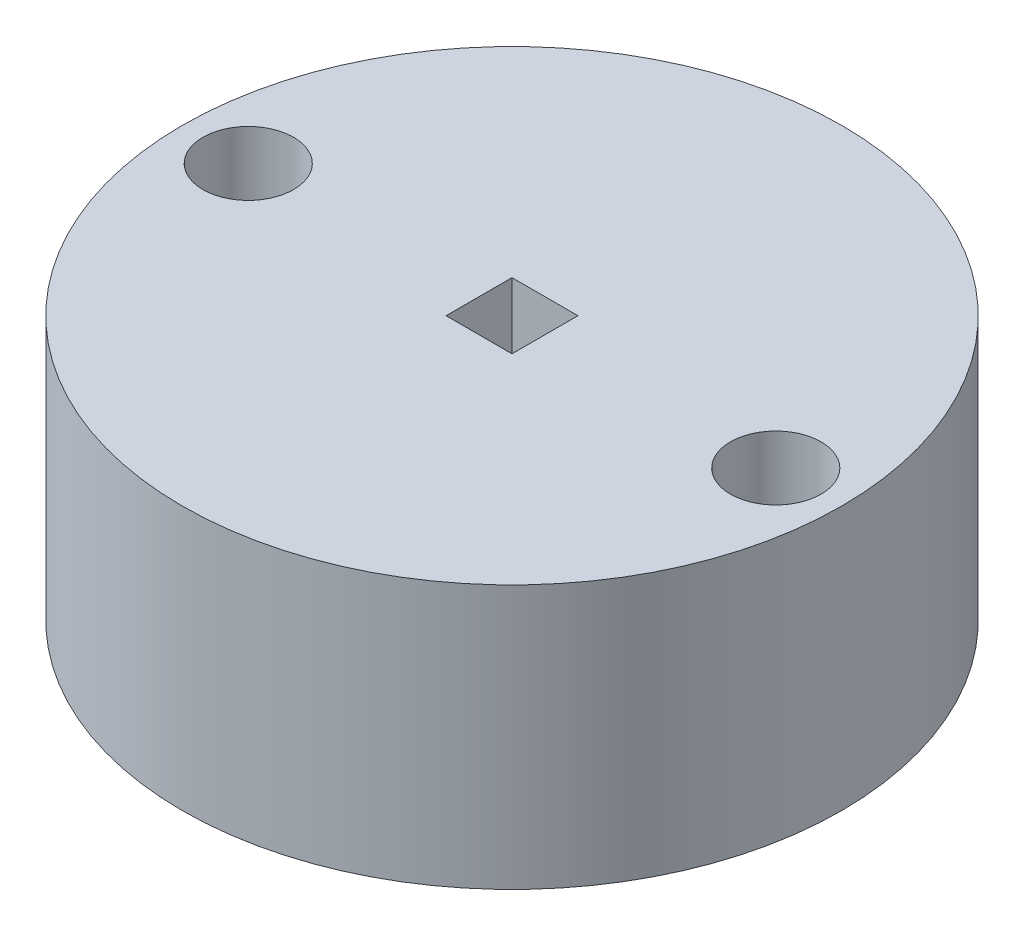
ISO-10303-21;
HEADER;
FILE_DESCRIPTION(('STEP AP214'),'2;1');
FILE_NAME('part.step','',(''),(''),'','','');
FILE_SCHEMA(('AUTOMOTIVE_DESIGN { 1 0 10303 214 1 1 1 1 }'));
ENDSEC;
DATA;
#1=APPLICATION_CONTEXT('core data for automotive mechanical design processes');
#2=APPLICATION_PROTOCOL_DEFINITION('international standard','automotive_design',2000,#1);
#3=PRODUCT_CONTEXT('',#1,'mechanical');
#4=PRODUCT('Part','Part','',(#3));
#5=PRODUCT_RELATED_PRODUCT_CATEGORY('part','',(#4));
#6=PRODUCT_DEFINITION_FORMATION('','',#4);
#7=PRODUCT_DEFINITION_CONTEXT('part definition',#1,'design');
#8=PRODUCT_DEFINITION('design','',#6,#7);
#9=PRODUCT_DEFINITION_SHAPE('','',#8);
#10=(LENGTH_UNIT() NAMED_UNIT(*) SI_UNIT(.MILLI.,.METRE.));
#11=(NAMED_UNIT(*) PLANE_ANGLE_UNIT() SI_UNIT($,.RADIAN.));
#12=(NAMED_UNIT(*) SI_UNIT($,.STERADIAN.) SOLID_ANGLE_UNIT());
#13=UNCERTAINTY_MEASURE_WITH_UNIT(LENGTH_MEASURE(1.E-05),#10,'distance_accuracy_value','');
#14=(GEOMETRIC_REPRESENTATION_CONTEXT(3) GLOBAL_UNCERTAINTY_ASSIGNED_CONTEXT((#13)) GLOBAL_UNIT_ASSIGNED_CONTEXT((#10,
#11,#12)) REPRESENTATION_CONTEXT('',''));
#15=CARTESIAN_POINT('',(0.,0.,0.));
#16=DIRECTION('',(0.,0.,1.));
#17=DIRECTION('',(1.,0.,0.));
#18=AXIS2_PLACEMENT_3D('',#15,#16,#17);
#19=CARTESIAN_POINT('',(0.,12.7,0.));
#20=DIRECTION('',(0.,1.,0.));
#21=DIRECTION('',(0.,0.,1.));
#22=AXIS2_PLACEMENT_3D('',#19,#20,#21);
#23=PLANE('',#22);
#24=CARTESIAN_POINT('',(12.7,12.7,0.));
#25=DIRECTION('',(0.,1.,0.));
#26=DIRECTION('',(0.,0.,1.));
#27=AXIS2_PLACEMENT_3D('',#24,#25,#26);
#28=CIRCLE('',#27,2.1828125);
#29=CARTESIAN_POINT('',(12.7,12.7,2.1828125));
#30=VERTEX_POINT('',#29);
#31=EDGE_CURVE('E115',#30,#30,#28,.T.);
#32=ORIENTED_EDGE('',*,*,#31,.F.);
#33=EDGE_LOOP('',(#32));
#34=FACE_BOUND('',#33,.T.);
#35=CARTESIAN_POINT('',(0.,12.7,0.));
#36=DIRECTION('',(0.,1.,0.));
#37=DIRECTION('',(0.,0.,1.));
#38=AXIS2_PLACEMENT_3D('',#35,#36,#37);
#39=CIRCLE('',#38,15.875);
#40=CARTESIAN_POINT('',(0.,12.7,15.875));
#41=VERTEX_POINT('',#40);
#42=EDGE_CURVE('E11',#41,#41,#39,.T.);
#43=ORIENTED_EDGE('',*,*,#42,.T.);
#44=EDGE_LOOP('',(#43));
#45=FACE_BOUND('',#44,.T.);
#46=DIRECTION('',(-1.,0.,0.));
#47=VECTOR('',#46,1.);
#48=CARTESIAN_POINT('',(-1.5875,12.7,-1.5875));
#49=LINE('',#48,#47);
#50=CARTESIAN_POINT('',(1.5875,12.7,-1.5875));
#51=VERTEX_POINT('',#50);
#52=CARTESIAN_POINT('',(-1.5875,12.7,-1.5875));
#53=VERTEX_POINT('',#52);
#54=EDGE_CURVE('E90',#51,#53,#49,.T.);
#55=ORIENTED_EDGE('',*,*,#54,.F.);
#56=DIRECTION('',(0.,0.,-1.));
#57=VECTOR('',#56,1.);
#58=CARTESIAN_POINT('',(1.5875,12.7,1.5875));
#59=LINE('',#58,#57);
#60=CARTESIAN_POINT('',(1.5875,12.7,1.5875));
#61=VERTEX_POINT('',#60);
#62=EDGE_CURVE('E81',#61,#51,#59,.T.);
#63=ORIENTED_EDGE('',*,*,#62,.F.);
#64=DIRECTION('',(1.,0.,0.));
#65=VECTOR('',#64,1.);
#66=CARTESIAN_POINT('',(-1.5875,12.7,1.5875));
#67=LINE('',#66,#65);
#68=CARTESIAN_POINT('',(-1.5875,12.7,1.5875));
#69=VERTEX_POINT('',#68);
#70=EDGE_CURVE('E107',#69,#61,#67,.T.);
#71=ORIENTED_EDGE('',*,*,#70,.F.);
#72=DIRECTION('',(0.,0.,1.));
#73=VECTOR('',#72,1.);
#74=CARTESIAN_POINT('',(-1.5875,12.7,1.5875));
#75=LINE('',#74,#73);
#76=EDGE_CURVE('E103',#53,#69,#75,.T.);
#77=ORIENTED_EDGE('',*,*,#76,.F.);
#78=EDGE_LOOP('',(#55,#63,#71,#77));
#79=FACE_BOUND('',#78,.T.);
#80=CARTESIAN_POINT('',(-12.7,12.7,0.));
#81=DIRECTION('',(0.,1.,0.));
#82=DIRECTION('',(0.,0.,1.));
#83=AXIS2_PLACEMENT_3D('',#80,#81,#82);
#84=CIRCLE('',#83,2.1828125);
#85=CARTESIAN_POINT('',(-12.7,12.7,2.1828125));
#86=VERTEX_POINT('',#85);
#87=EDGE_CURVE('E196',#86,#86,#84,.T.);
#88=ORIENTED_EDGE('',*,*,#87,.F.);
#89=EDGE_LOOP('',(#88));
#90=FACE_BOUND('',#89,.T.);
#91=ADVANCED_FACE('F39',(#34,#45,#79,#90),#23,.T.);
#92=CARTESIAN_POINT('',(0.,0.,0.));
#93=DIRECTION('',(0.,1.,0.));
#94=DIRECTION('',(0.,0.,1.));
#95=AXIS2_PLACEMENT_3D('',#92,#93,#94);
#96=PLANE('',#95);
#97=CARTESIAN_POINT('',(0.,0.,0.));
#98=DIRECTION('',(0.,1.,0.));
#99=DIRECTION('',(0.,0.,1.));
#100=AXIS2_PLACEMENT_3D('',#97,#98,#99);
#101=CIRCLE('',#100,15.875);
#102=CARTESIAN_POINT('',(0.,0.,15.875));
#103=VERTEX_POINT('',#102);
#104=EDGE_CURVE('E43',#103,#103,#101,.T.);
#105=ORIENTED_EDGE('',*,*,#104,.F.);
#106=EDGE_LOOP('',(#105));
#107=FACE_BOUND('',#106,.T.);
#108=DIRECTION('',(0.,0.,-1.));
#109=VECTOR('',#108,1.);
#110=CARTESIAN_POINT('',(1.5875,0.,1.5875));
#111=LINE('',#110,#109);
#112=CARTESIAN_POINT('',(1.5875,0.,1.5875));
#113=VERTEX_POINT('',#112);
#114=CARTESIAN_POINT('',(1.5875,0.,-1.5875));
#115=VERTEX_POINT('',#114);
#116=EDGE_CURVE('E63',#113,#115,#111,.T.);
#117=ORIENTED_EDGE('',*,*,#116,.T.);
#118=DIRECTION('',(-1.,0.,0.));
#119=VECTOR('',#118,1.);
#120=CARTESIAN_POINT('',(-1.5875,0.,-1.5875));
#121=LINE('',#120,#119);
#122=CARTESIAN_POINT('',(-1.5875,0.,-1.5875));
#123=VERTEX_POINT('',#122);
#124=EDGE_CURVE('E97',#115,#123,#121,.T.);
#125=ORIENTED_EDGE('',*,*,#124,.T.);
#126=DIRECTION('',(0.,0.,1.));
#127=VECTOR('',#126,1.);
#128=CARTESIAN_POINT('',(-1.5875,0.,1.5875));
#129=LINE('',#128,#127);
#130=CARTESIAN_POINT('',(-1.5875,0.,1.5875));
#131=VERTEX_POINT('',#130);
#132=EDGE_CURVE('E118',#123,#131,#129,.T.);
#133=ORIENTED_EDGE('',*,*,#132,.T.);
#134=DIRECTION('',(1.,0.,0.));
#135=VECTOR('',#134,1.);
#136=CARTESIAN_POINT('',(-1.5875,0.,1.5875));
#137=LINE('',#136,#135);
#138=EDGE_CURVE('E91',#131,#113,#137,.T.);
#139=ORIENTED_EDGE('',*,*,#138,.T.);
#140=EDGE_LOOP('',(#117,#125,#133,#139));
#141=FACE_BOUND('',#140,.T.);
#142=CARTESIAN_POINT('',(12.7,0.,0.));
#143=DIRECTION('',(0.,1.,0.));
#144=DIRECTION('',(0.,0.,1.));
#145=AXIS2_PLACEMENT_3D('',#142,#143,#144);
#146=CIRCLE('',#145,2.1828125);
#147=CARTESIAN_POINT('',(12.7,0.,2.1828125));
#148=VERTEX_POINT('',#147);
#149=EDGE_CURVE('E204',#148,#148,#146,.T.);
#150=ORIENTED_EDGE('',*,*,#149,.T.);
#151=EDGE_LOOP('',(#150));
#152=FACE_BOUND('',#151,.T.);
#153=CARTESIAN_POINT('',(-12.7,0.,0.));
#154=DIRECTION('',(0.,1.,0.));
#155=DIRECTION('',(0.,0.,1.));
#156=AXIS2_PLACEMENT_3D('',#153,#154,#155);
#157=CIRCLE('',#156,2.1828125);
#158=CARTESIAN_POINT('',(-12.7,0.,2.1828125));
#159=VERTEX_POINT('',#158);
#160=EDGE_CURVE('E199',#159,#159,#157,.T.);
#161=ORIENTED_EDGE('',*,*,#160,.T.);
#162=EDGE_LOOP('',(#161));
#163=FACE_BOUND('',#162,.T.);
#164=ADVANCED_FACE('F134',(#107,#141,#152,#163),#96,.F.);
#165=CARTESIAN_POINT('',(0.,12.7,0.));
#166=DIRECTION('',(0.,-1.,0.));
#167=DIRECTION('',(0.,0.,-1.));
#168=AXIS2_PLACEMENT_3D('',#165,#166,#167);
#169=CYLINDRICAL_SURFACE('',#168,15.875);
#170=ORIENTED_EDGE('',*,*,#42,.F.);
#171=EDGE_LOOP('',(#170));
#172=FACE_BOUND('',#171,.T.);
#173=ORIENTED_EDGE('',*,*,#104,.T.);
#174=EDGE_LOOP('',(#173));
#175=FACE_BOUND('',#174,.T.);
#176=ADVANCED_FACE('F41',(#172,#175),#169,.T.);
#177=CARTESIAN_POINT('',(1.5875,12.7,1.5875));
#178=DIRECTION('',(-1.,0.,0.));
#179=DIRECTION('',(0.,0.,1.));
#180=AXIS2_PLACEMENT_3D('',#177,#178,#179);
#181=PLANE('',#180);
#182=ORIENTED_EDGE('',*,*,#116,.F.);
#183=DIRECTION('',(0.,-1.,0.));
#184=VECTOR('',#183,1.);
#185=CARTESIAN_POINT('',(1.5875,12.7,1.5875));
#186=LINE('',#185,#184);
#187=EDGE_CURVE('E85',#61,#113,#186,.T.);
#188=ORIENTED_EDGE('',*,*,#187,.F.);
#189=ORIENTED_EDGE('',*,*,#62,.T.);
#190=DIRECTION('',(0.,-1.,0.));
#191=VECTOR('',#190,1.);
#192=CARTESIAN_POINT('',(1.5875,12.7,-1.5875));
#193=LINE('',#192,#191);
#194=EDGE_CURVE('E84',#51,#115,#193,.T.);
#195=ORIENTED_EDGE('',*,*,#194,.T.);
#196=EDGE_LOOP('',(#182,#188,#189,#195));
#197=FACE_BOUND('',#196,.T.);
#198=ADVANCED_FACE('F83',(#197),#181,.T.);
#199=CARTESIAN_POINT('',(-1.5875,12.7,-1.5875));
#200=DIRECTION('',(0.,0.,1.));
#201=DIRECTION('',(1.,0.,0.));
#202=AXIS2_PLACEMENT_3D('',#199,#200,#201);
#203=PLANE('',#202);
#204=ORIENTED_EDGE('',*,*,#124,.F.);
#205=ORIENTED_EDGE('',*,*,#194,.F.);
#206=ORIENTED_EDGE('',*,*,#54,.T.);
#207=DIRECTION('',(0.,-1.,0.));
#208=VECTOR('',#207,1.);
#209=CARTESIAN_POINT('',(-1.5875,12.7,-1.5875));
#210=LINE('',#209,#208);
#211=EDGE_CURVE('E99',#53,#123,#210,.T.);
#212=ORIENTED_EDGE('',*,*,#211,.T.);
#213=EDGE_LOOP('',(#204,#205,#206,#212));
#214=FACE_BOUND('',#213,.T.);
#215=ADVANCED_FACE('F94',(#214),#203,.T.);
#216=CARTESIAN_POINT('',(-1.5875,12.7,1.5875));
#217=DIRECTION('',(1.,0.,0.));
#218=DIRECTION('',(0.,0.,-1.));
#219=AXIS2_PLACEMENT_3D('',#216,#217,#218);
#220=PLANE('',#219);
#221=ORIENTED_EDGE('',*,*,#132,.F.);
#222=ORIENTED_EDGE('',*,*,#211,.F.);
#223=ORIENTED_EDGE('',*,*,#76,.T.);
#224=DIRECTION('',(0.,-1.,0.));
#225=VECTOR('',#224,1.);
#226=CARTESIAN_POINT('',(-1.5875,12.7,1.5875));
#227=LINE('',#226,#225);
#228=EDGE_CURVE('E55',#69,#131,#227,.T.);
#229=ORIENTED_EDGE('',*,*,#228,.T.);
#230=EDGE_LOOP('',(#221,#222,#223,#229));
#231=FACE_BOUND('',#230,.T.);
#232=ADVANCED_FACE('F132',(#231),#220,.T.);
#233=CARTESIAN_POINT('',(-1.5875,12.7,1.5875));
#234=DIRECTION('',(0.,0.,-1.));
#235=DIRECTION('',(-1.,0.,0.));
#236=AXIS2_PLACEMENT_3D('',#233,#234,#235);
#237=PLANE('',#236);
#238=ORIENTED_EDGE('',*,*,#138,.F.);
#239=ORIENTED_EDGE('',*,*,#228,.F.);
#240=ORIENTED_EDGE('',*,*,#70,.T.);
#241=ORIENTED_EDGE('',*,*,#187,.T.);
#242=EDGE_LOOP('',(#238,#239,#240,#241));
#243=FACE_BOUND('',#242,.T.);
#244=ADVANCED_FACE('F136',(#243),#237,.T.);
#245=CARTESIAN_POINT('',(12.7,12.7,0.));
#246=DIRECTION('',(0.,-1.,0.));
#247=DIRECTION('',(0.,0.,-1.));
#248=AXIS2_PLACEMENT_3D('',#245,#246,#247);
#249=CYLINDRICAL_SURFACE('',#248,2.1828125);
#250=ORIENTED_EDGE('',*,*,#31,.T.);
#251=EDGE_LOOP('',(#250));
#252=FACE_BOUND('',#251,.T.);
#253=ORIENTED_EDGE('',*,*,#149,.F.);
#254=EDGE_LOOP('',(#253));
#255=FACE_BOUND('',#254,.T.);
#256=ADVANCED_FACE('F138',(#252,#255),#249,.F.);
#257=CARTESIAN_POINT('',(-12.7,12.7,0.));
#258=DIRECTION('',(0.,-1.,0.));
#259=DIRECTION('',(0.,0.,-1.));
#260=AXIS2_PLACEMENT_3D('',#257,#258,#259);
#261=CYLINDRICAL_SURFACE('',#260,2.1828125);
#262=ORIENTED_EDGE('',*,*,#87,.T.);
#263=EDGE_LOOP('',(#262));
#264=FACE_BOUND('',#263,.T.);
#265=ORIENTED_EDGE('',*,*,#160,.F.);
#266=EDGE_LOOP('',(#265));
#267=FACE_BOUND('',#266,.T.);
#268=ADVANCED_FACE('F144',(#264,#267),#261,.F.);
#269=CLOSED_SHELL('',(#91,#164,#176,#198,#215,#232,#244,#256,#268));
#270=MANIFOLD_SOLID_BREP('B2',#269);
#271=ADVANCED_BREP_SHAPE_REPRESENTATION('',(#18,#270),#14);
#272=SHAPE_DEFINITION_REPRESENTATION(#9,#271);
ENDSEC;
END-ISO-10303-21;
